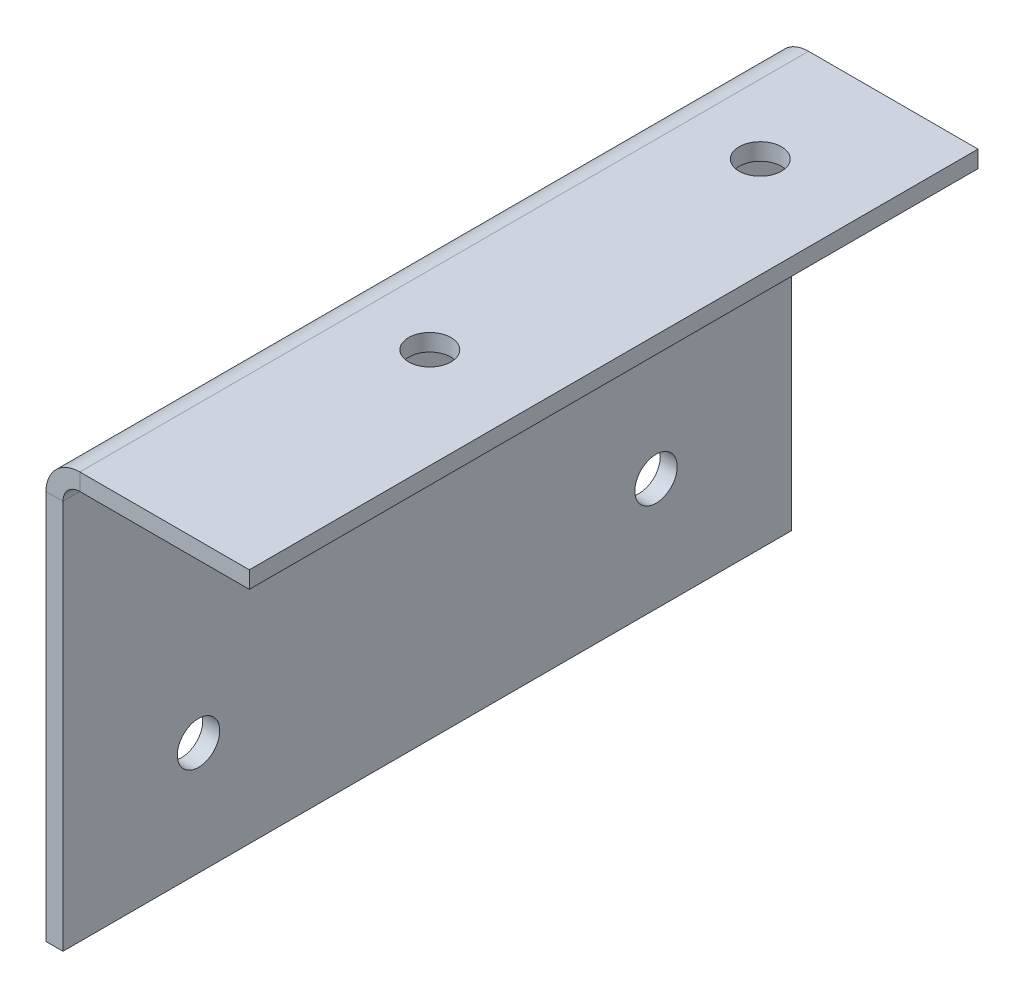
ISO-10303-21;
HEADER;
FILE_DESCRIPTION(('STEP AP214'),'2;1');
FILE_NAME('part.step','',(''),(''),'','','');
FILE_SCHEMA(('AUTOMOTIVE_DESIGN { 1 0 10303 214 1 1 1 1 }'));
ENDSEC;
DATA;
#1=APPLICATION_CONTEXT('core data for automotive mechanical design processes');
#2=APPLICATION_PROTOCOL_DEFINITION('international standard','automotive_design',2000,#1);
#3=PRODUCT_CONTEXT('',#1,'mechanical');
#4=PRODUCT('Part','Part','',(#3));
#5=PRODUCT_RELATED_PRODUCT_CATEGORY('part','',(#4));
#6=PRODUCT_DEFINITION_FORMATION('','',#4);
#7=PRODUCT_DEFINITION_CONTEXT('part definition',#1,'design');
#8=PRODUCT_DEFINITION('design','',#6,#7);
#9=PRODUCT_DEFINITION_SHAPE('','',#8);
#10=(LENGTH_UNIT() NAMED_UNIT(*) SI_UNIT(.MILLI.,.METRE.));
#11=(NAMED_UNIT(*) PLANE_ANGLE_UNIT() SI_UNIT($,.RADIAN.));
#12=(NAMED_UNIT(*) SI_UNIT($,.STERADIAN.) SOLID_ANGLE_UNIT());
#13=UNCERTAINTY_MEASURE_WITH_UNIT(LENGTH_MEASURE(1.E-05),#10,'distance_accuracy_value','');
#14=(GEOMETRIC_REPRESENTATION_CONTEXT(3) GLOBAL_UNCERTAINTY_ASSIGNED_CONTEXT((#13)) GLOBAL_UNIT_ASSIGNED_CONTEXT((#10,
#11,#12)) REPRESENTATION_CONTEXT('',''));
#15=CARTESIAN_POINT('',(0.,0.,0.));
#16=DIRECTION('',(0.,0.,1.));
#17=DIRECTION('',(1.,0.,0.));
#18=AXIS2_PLACEMENT_3D('',#15,#16,#17);
#19=CARTESIAN_POINT('',(-1.,12.5,21.5));
#20=DIRECTION('',(0.,0.,1.));
#21=DIRECTION('',(1.,0.,0.));
#22=AXIS2_PLACEMENT_3D('',#19,#20,#21);
#23=PLANE('',#22);
#24=DIRECTION('',(0.,-1.,0.));
#25=VECTOR('',#24,1.);
#26=CARTESIAN_POINT('',(0.,12.5,21.5));
#27=LINE('',#26,#25);
#28=CARTESIAN_POINT('',(0.,10.5,21.5));
#29=VERTEX_POINT('',#28);
#30=CARTESIAN_POINT('',(0.,-12.5,21.5));
#31=VERTEX_POINT('',#30);
#32=EDGE_CURVE('E103',#29,#31,#27,.T.);
#33=ORIENTED_EDGE('',*,*,#32,.F.);
#34=DIRECTION('',(-1.,0.,0.));
#35=VECTOR('',#34,1.);
#36=CARTESIAN_POINT('',(0.,10.5,21.5));
#37=LINE('',#36,#35);
#38=CARTESIAN_POINT('',(-1.,10.5,21.5));
#39=VERTEX_POINT('',#38);
#40=EDGE_CURVE('E183',#29,#39,#37,.T.);
#41=ORIENTED_EDGE('',*,*,#40,.T.);
#42=DIRECTION('',(0.,-1.,0.));
#43=VECTOR('',#42,1.);
#44=CARTESIAN_POINT('',(-1.,12.5,21.5));
#45=LINE('',#44,#43);
#46=CARTESIAN_POINT('',(-1.,-12.5,21.5));
#47=VERTEX_POINT('',#46);
#48=EDGE_CURVE('E109',#39,#47,#45,.T.);
#49=ORIENTED_EDGE('',*,*,#48,.T.);
#50=DIRECTION('',(1.,0.,0.));
#51=VECTOR('',#50,1.);
#52=CARTESIAN_POINT('',(-1.,-12.5,21.5));
#53=LINE('',#52,#51);
#54=EDGE_CURVE('E65',#47,#31,#53,.T.);
#55=ORIENTED_EDGE('',*,*,#54,.T.);
#56=EDGE_LOOP('',(#33,#41,#49,#55));
#57=FACE_BOUND('',#56,.T.);
#58=ADVANCED_FACE('F56',(#57),#23,.T.);
#59=CARTESIAN_POINT('',(-1.,0.,0.));
#60=DIRECTION('',(1.,0.,0.));
#61=DIRECTION('',(0.,0.,-1.));
#62=AXIS2_PLACEMENT_3D('',#59,#60,#61);
#63=PLANE('',#62);
#64=CARTESIAN_POINT('',(-1.,-5.84801831703269,-13.5));
#65=DIRECTION('',(1.,0.,0.));
#66=DIRECTION('',(0.,0.,-1.));
#67=AXIS2_PLACEMENT_3D('',#64,#65,#66);
#68=CIRCLE('',#67,1.24999999999999);
#69=CARTESIAN_POINT('',(-1.,-5.84801831703269,-14.75));
#70=VERTEX_POINT('',#69);
#71=EDGE_CURVE('E121',#70,#70,#68,.T.);
#72=ORIENTED_EDGE('',*,*,#71,.T.);
#73=EDGE_LOOP('',(#72));
#74=FACE_BOUND('',#73,.T.);
#75=CARTESIAN_POINT('',(-1.,-5.84801831703269,13.5));
#76=DIRECTION('',(1.,0.,0.));
#77=DIRECTION('',(0.,0.,-1.));
#78=AXIS2_PLACEMENT_3D('',#75,#76,#77);
#79=CIRCLE('',#78,1.24999999999999);
#80=CARTESIAN_POINT('',(-1.,-5.84801831703269,12.25));
#81=VERTEX_POINT('',#80);
#82=EDGE_CURVE('E118',#81,#81,#79,.T.);
#83=ORIENTED_EDGE('',*,*,#82,.T.);
#84=EDGE_LOOP('',(#83));
#85=FACE_BOUND('',#84,.T.);
#86=DIRECTION('',(0.,0.,1.));
#87=VECTOR('',#86,1.);
#88=CARTESIAN_POINT('',(-1.,10.5,21.5));
#89=LINE('',#88,#87);
#90=CARTESIAN_POINT('',(-1.,10.5,-21.5));
#91=VERTEX_POINT('',#90);
#92=EDGE_CURVE('E176',#39,#91,#89,.F.);
#93=ORIENTED_EDGE('',*,*,#92,.T.);
#94=DIRECTION('',(0.,1.,0.));
#95=VECTOR('',#94,1.);
#96=CARTESIAN_POINT('',(-1.,12.5,-21.5));
#97=LINE('',#96,#95);
#98=CARTESIAN_POINT('',(-1.,-12.5,-21.5));
#99=VERTEX_POINT('',#98);
#100=EDGE_CURVE('E107',#99,#91,#97,.T.);
#101=ORIENTED_EDGE('',*,*,#100,.F.);
#102=DIRECTION('',(0.,0.,-1.));
#103=VECTOR('',#102,1.);
#104=CARTESIAN_POINT('',(-1.,-12.5,21.5));
#105=LINE('',#104,#103);
#106=EDGE_CURVE('E97',#47,#99,#105,.T.);
#107=ORIENTED_EDGE('',*,*,#106,.F.);
#108=ORIENTED_EDGE('',*,*,#48,.F.);
#109=EDGE_LOOP('',(#93,#101,#107,#108));
#110=FACE_BOUND('',#109,.T.);
#111=ADVANCED_FACE('F202',(#74,#85,#110),#63,.F.);
#112=CARTESIAN_POINT('',(0.,0.,0.));
#113=DIRECTION('',(1.,0.,0.));
#114=DIRECTION('',(0.,0.,-1.));
#115=AXIS2_PLACEMENT_3D('',#112,#113,#114);
#116=PLANE('',#115);
#117=CARTESIAN_POINT('',(0.,-5.84801831703269,-13.5));
#118=DIRECTION('',(1.,0.,0.));
#119=DIRECTION('',(0.,0.,-1.));
#120=AXIS2_PLACEMENT_3D('',#117,#118,#119);
#121=CIRCLE('',#120,1.24999999999999);
#122=CARTESIAN_POINT('',(0.,-5.84801831703269,-14.75));
#123=VERTEX_POINT('',#122);
#124=EDGE_CURVE('E60',#123,#123,#121,.T.);
#125=ORIENTED_EDGE('',*,*,#124,.F.);
#126=EDGE_LOOP('',(#125));
#127=FACE_BOUND('',#126,.T.);
#128=CARTESIAN_POINT('',(0.,-5.84801831703269,13.5));
#129=DIRECTION('',(1.,0.,0.));
#130=DIRECTION('',(0.,0.,-1.));
#131=AXIS2_PLACEMENT_3D('',#128,#129,#130);
#132=CIRCLE('',#131,1.24999999999999);
#133=CARTESIAN_POINT('',(0.,-5.84801831703269,12.25));
#134=VERTEX_POINT('',#133);
#135=EDGE_CURVE('E120',#134,#134,#132,.T.);
#136=ORIENTED_EDGE('',*,*,#135,.F.);
#137=EDGE_LOOP('',(#136));
#138=FACE_BOUND('',#137,.T.);
#139=DIRECTION('',(0.,1.,0.));
#140=VECTOR('',#139,1.);
#141=CARTESIAN_POINT('',(0.,12.5,-21.5));
#142=LINE('',#141,#140);
#143=CARTESIAN_POINT('',(0.,-12.5,-21.5));
#144=VERTEX_POINT('',#143);
#145=CARTESIAN_POINT('',(0.,10.5,-21.5));
#146=VERTEX_POINT('',#145);
#147=EDGE_CURVE('E99',#144,#146,#142,.T.);
#148=ORIENTED_EDGE('',*,*,#147,.T.);
#149=DIRECTION('',(0.,0.,1.));
#150=VECTOR('',#149,1.);
#151=CARTESIAN_POINT('',(0.,10.5,21.5));
#152=LINE('',#151,#150);
#153=EDGE_CURVE('E73',#29,#146,#152,.F.);
#154=ORIENTED_EDGE('',*,*,#153,.F.);
#155=ORIENTED_EDGE('',*,*,#32,.T.);
#156=DIRECTION('',(0.,0.,-1.));
#157=VECTOR('',#156,1.);
#158=CARTESIAN_POINT('',(0.,-12.5,21.5));
#159=LINE('',#158,#157);
#160=EDGE_CURVE('E95',#31,#144,#159,.T.);
#161=ORIENTED_EDGE('',*,*,#160,.T.);
#162=EDGE_LOOP('',(#148,#154,#155,#161));
#163=FACE_BOUND('',#162,.T.);
#164=ADVANCED_FACE('F105',(#127,#138,#163),#116,.T.);
#165=CARTESIAN_POINT('',(-1.,12.5,-21.5));
#166=DIRECTION('',(0.,0.,-1.));
#167=DIRECTION('',(-1.,0.,0.));
#168=AXIS2_PLACEMENT_3D('',#165,#166,#167);
#169=PLANE('',#168);
#170=DIRECTION('',(-1.,0.,0.));
#171=VECTOR('',#170,1.);
#172=CARTESIAN_POINT('',(0.,10.5,-21.5));
#173=LINE('',#172,#171);
#174=EDGE_CURVE('E102',#146,#91,#173,.T.);
#175=ORIENTED_EDGE('',*,*,#174,.F.);
#176=ORIENTED_EDGE('',*,*,#147,.F.);
#177=DIRECTION('',(1.,0.,0.));
#178=VECTOR('',#177,1.);
#179=CARTESIAN_POINT('',(-1.,-12.5,-21.5));
#180=LINE('',#179,#178);
#181=EDGE_CURVE('E13',#99,#144,#180,.T.);
#182=ORIENTED_EDGE('',*,*,#181,.F.);
#183=ORIENTED_EDGE('',*,*,#100,.T.);
#184=EDGE_LOOP('',(#175,#176,#182,#183));
#185=FACE_BOUND('',#184,.T.);
#186=ADVANCED_FACE('F58',(#185),#169,.T.);
#187=CARTESIAN_POINT('',(-1.,-12.5,21.5));
#188=DIRECTION('',(0.,-1.,0.));
#189=DIRECTION('',(0.,0.,-1.));
#190=AXIS2_PLACEMENT_3D('',#187,#188,#189);
#191=PLANE('',#190);
#192=ORIENTED_EDGE('',*,*,#160,.F.);
#193=ORIENTED_EDGE('',*,*,#54,.F.);
#194=ORIENTED_EDGE('',*,*,#106,.T.);
#195=ORIENTED_EDGE('',*,*,#181,.T.);
#196=EDGE_LOOP('',(#192,#193,#194,#195));
#197=FACE_BOUND('',#196,.T.);
#198=ADVANCED_FACE('F92',(#197),#191,.T.);
#199=CARTESIAN_POINT('',(0.999999999999999,10.5,-21.5));
#200=DIRECTION('',(0.,0.,-1.));
#201=DIRECTION('',(-1.,0.,0.));
#202=AXIS2_PLACEMENT_3D('',#199,#200,#201);
#203=PLANE('',#202);
#204=DIRECTION('',(0.,-1.,0.));
#205=VECTOR('',#204,1.);
#206=CARTESIAN_POINT('',(0.999999999999994,12.5,-21.5));
#207=LINE('',#206,#205);
#208=CARTESIAN_POINT('',(0.999999999999996,11.5,-21.5));
#209=VERTEX_POINT('',#208);
#210=CARTESIAN_POINT('',(0.999999999999992,12.5,-21.5));
#211=VERTEX_POINT('',#210);
#212=EDGE_CURVE('E139',#209,#211,#207,.F.);
#213=ORIENTED_EDGE('',*,*,#212,.F.);
#214=CARTESIAN_POINT('',(0.999999999999999,10.5,-21.5));
#215=DIRECTION('',(0.,0.,1.));
#216=DIRECTION('',(1.,0.,0.));
#217=AXIS2_PLACEMENT_3D('',#214,#215,#216);
#218=CIRCLE('',#217,1.);
#219=EDGE_CURVE('E186',#146,#209,#218,.F.);
#220=ORIENTED_EDGE('',*,*,#219,.F.);
#221=ORIENTED_EDGE('',*,*,#174,.T.);
#222=CARTESIAN_POINT('',(0.999999999999999,10.5,-21.5));
#223=DIRECTION('',(0.,0.,1.));
#224=DIRECTION('',(1.,0.,0.));
#225=AXIS2_PLACEMENT_3D('',#222,#223,#224);
#226=CIRCLE('',#225,2.);
#227=EDGE_CURVE('E179',#91,#211,#226,.F.);
#228=ORIENTED_EDGE('',*,*,#227,.T.);
#229=EDGE_LOOP('',(#213,#220,#221,#228));
#230=FACE_BOUND('',#229,.T.);
#231=ADVANCED_FACE('F207',(#230),#203,.T.);
#232=CARTESIAN_POINT('',(0.999999999999999,10.5,21.5));
#233=DIRECTION('',(0.,0.,-1.));
#234=DIRECTION('',(-1.,0.,0.));
#235=AXIS2_PLACEMENT_3D('',#232,#233,#234);
#236=PLANE('',#235);
#237=CARTESIAN_POINT('',(0.999999999999999,10.5,21.5));
#238=DIRECTION('',(0.,0.,1.));
#239=DIRECTION('',(1.,0.,0.));
#240=AXIS2_PLACEMENT_3D('',#237,#238,#239);
#241=CIRCLE('',#240,1.);
#242=CARTESIAN_POINT('',(0.999999999999996,11.5,21.5));
#243=VERTEX_POINT('',#242);
#244=EDGE_CURVE('E143',#243,#29,#241,.T.);
#245=ORIENTED_EDGE('',*,*,#244,.F.);
#246=DIRECTION('',(0.,-1.,0.));
#247=VECTOR('',#246,1.);
#248=CARTESIAN_POINT('',(0.999999999999994,11.5,21.5));
#249=LINE('',#248,#247);
#250=CARTESIAN_POINT('',(0.99999999999999,12.5,21.5));
#251=VERTEX_POINT('',#250);
#252=EDGE_CURVE('E168',#243,#251,#249,.F.);
#253=ORIENTED_EDGE('',*,*,#252,.T.);
#254=CARTESIAN_POINT('',(0.999999999999999,10.5,21.5));
#255=DIRECTION('',(0.,0.,1.));
#256=DIRECTION('',(1.,0.,0.));
#257=AXIS2_PLACEMENT_3D('',#254,#255,#256);
#258=CIRCLE('',#257,2.);
#259=EDGE_CURVE('E180',#251,#39,#258,.T.);
#260=ORIENTED_EDGE('',*,*,#259,.T.);
#261=ORIENTED_EDGE('',*,*,#40,.F.);
#262=EDGE_LOOP('',(#245,#253,#260,#261));
#263=FACE_BOUND('',#262,.T.);
#264=ADVANCED_FACE('F251',(#263),#236,.F.);
#265=CARTESIAN_POINT('',(0.999999999999999,10.5,21.5));
#266=DIRECTION('',(0.,0.,1.));
#267=DIRECTION('',(0.,1.,0.));
#268=AXIS2_PLACEMENT_3D('',#265,#266,#267);
#269=CYLINDRICAL_SURFACE('',#268,2.);
#270=ORIENTED_EDGE('',*,*,#92,.F.);
#271=ORIENTED_EDGE('',*,*,#259,.F.);
#272=DIRECTION('',(0.,0.,1.));
#273=VECTOR('',#272,1.);
#274=CARTESIAN_POINT('',(0.999999999999994,12.5,-21.5));
#275=LINE('',#274,#273);
#276=EDGE_CURVE('E165',#251,#211,#275,.F.);
#277=ORIENTED_EDGE('',*,*,#276,.T.);
#278=ORIENTED_EDGE('',*,*,#227,.F.);
#279=EDGE_LOOP('',(#270,#271,#277,#278));
#280=FACE_BOUND('',#279,.T.);
#281=ADVANCED_FACE('F210',(#280),#269,.T.);
#282=CARTESIAN_POINT('',(0.999999999999999,10.5,21.5));
#283=DIRECTION('',(0.,0.,1.));
#284=DIRECTION('',(0.,1.,0.));
#285=AXIS2_PLACEMENT_3D('',#282,#283,#284);
#286=CYLINDRICAL_SURFACE('',#285,1.);
#287=ORIENTED_EDGE('',*,*,#153,.T.);
#288=ORIENTED_EDGE('',*,*,#219,.T.);
#289=DIRECTION('',(0.,0.,1.));
#290=VECTOR('',#289,1.);
#291=CARTESIAN_POINT('',(0.999999999999997,11.5,-21.5));
#292=LINE('',#291,#290);
#293=EDGE_CURVE('E171',#209,#243,#292,.T.);
#294=ORIENTED_EDGE('',*,*,#293,.T.);
#295=ORIENTED_EDGE('',*,*,#244,.T.);
#296=EDGE_LOOP('',(#287,#288,#294,#295));
#297=FACE_BOUND('',#296,.T.);
#298=ADVANCED_FACE('F247',(#297),#286,.F.);
#299=CARTESIAN_POINT('',(0.,12.5,-21.5));
#300=DIRECTION('',(0.,0.,1.));
#301=DIRECTION('',(1.,0.,0.));
#302=AXIS2_PLACEMENT_3D('',#299,#300,#301);
#303=PLANE('',#302);
#304=ORIENTED_EDGE('',*,*,#212,.T.);
#305=DIRECTION('',(-1.,0.,0.));
#306=VECTOR('',#305,1.);
#307=CARTESIAN_POINT('',(0.,12.5,-21.5));
#308=LINE('',#307,#306);
#309=CARTESIAN_POINT('',(11.,12.5,-21.5));
#310=VERTEX_POINT('',#309);
#311=EDGE_CURVE('E153',#310,#211,#308,.T.);
#312=ORIENTED_EDGE('',*,*,#311,.F.);
#313=DIRECTION('',(0.,-1.,0.));
#314=VECTOR('',#313,1.);
#315=CARTESIAN_POINT('',(11.,12.5,-21.5));
#316=LINE('',#315,#314);
#317=CARTESIAN_POINT('',(11.,11.5,-21.5));
#318=VERTEX_POINT('',#317);
#319=EDGE_CURVE('E144',#310,#318,#316,.T.);
#320=ORIENTED_EDGE('',*,*,#319,.T.);
#321=DIRECTION('',(1.,0.,0.));
#322=VECTOR('',#321,1.);
#323=CARTESIAN_POINT('',(0.,11.5,-21.5));
#324=LINE('',#323,#322);
#325=EDGE_CURVE('E162',#318,#209,#324,.F.);
#326=ORIENTED_EDGE('',*,*,#325,.T.);
#327=EDGE_LOOP('',(#304,#312,#320,#326));
#328=FACE_BOUND('',#327,.T.);
#329=ADVANCED_FACE('F308',(#328),#303,.F.);
#330=CARTESIAN_POINT('',(11.,12.5,21.5));
#331=DIRECTION('',(0.,0.,-1.));
#332=DIRECTION('',(-1.,0.,0.));
#333=AXIS2_PLACEMENT_3D('',#330,#331,#332);
#334=PLANE('',#333);
#335=ORIENTED_EDGE('',*,*,#252,.F.);
#336=DIRECTION('',(-1.,0.,0.));
#337=VECTOR('',#336,1.);
#338=CARTESIAN_POINT('',(11.,11.5,21.5));
#339=LINE('',#338,#337);
#340=CARTESIAN_POINT('',(11.,11.5,21.5));
#341=VERTEX_POINT('',#340);
#342=EDGE_CURVE('E159',#243,#341,#339,.F.);
#343=ORIENTED_EDGE('',*,*,#342,.T.);
#344=DIRECTION('',(0.,-1.,0.));
#345=VECTOR('',#344,1.);
#346=CARTESIAN_POINT('',(11.,12.5,21.5));
#347=LINE('',#346,#345);
#348=CARTESIAN_POINT('',(11.,12.5,21.5));
#349=VERTEX_POINT('',#348);
#350=EDGE_CURVE('E140',#349,#341,#347,.T.);
#351=ORIENTED_EDGE('',*,*,#350,.F.);
#352=DIRECTION('',(1.,0.,0.));
#353=VECTOR('',#352,1.);
#354=CARTESIAN_POINT('',(0.,12.5,21.5));
#355=LINE('',#354,#353);
#356=EDGE_CURVE('E150',#251,#349,#355,.T.);
#357=ORIENTED_EDGE('',*,*,#356,.F.);
#358=EDGE_LOOP('',(#335,#343,#351,#357));
#359=FACE_BOUND('',#358,.T.);
#360=ADVANCED_FACE('F226',(#359),#334,.F.);
#361=CARTESIAN_POINT('',(0.,12.5,0.));
#362=DIRECTION('',(0.,-1.,0.));
#363=DIRECTION('',(1.,0.,0.));
#364=AXIS2_PLACEMENT_3D('',#361,#362,#363);
#365=PLANE('',#364);
#366=CARTESIAN_POINT('',(5.08000000020808,12.5,4.92923767251513));
#367=DIRECTION('',(0.,1.,0.));
#368=DIRECTION('',(0.,0.,1.));
#369=AXIS2_PLACEMENT_3D('',#366,#367,#368);
#370=CIRCLE('',#369,1.24999999999999);
#371=CARTESIAN_POINT('',(5.08000000020808,12.5,6.17923767251512));
#372=VERTEX_POINT('',#371);
#373=EDGE_CURVE('E117',#372,#372,#370,.T.);
#374=ORIENTED_EDGE('',*,*,#373,.F.);
#375=EDGE_LOOP('',(#374));
#376=FACE_BOUND('',#375,.T.);
#377=CARTESIAN_POINT('',(5.08000000020808,12.5,-14.5707623274849));
#378=DIRECTION('',(0.,1.,0.));
#379=DIRECTION('',(0.,0.,1.));
#380=AXIS2_PLACEMENT_3D('',#377,#378,#379);
#381=CIRCLE('',#380,1.24999999999999);
#382=CARTESIAN_POINT('',(5.08000000020808,12.5,-13.3207623274849));
#383=VERTEX_POINT('',#382);
#384=EDGE_CURVE('E116',#383,#383,#381,.T.);
#385=ORIENTED_EDGE('',*,*,#384,.F.);
#386=EDGE_LOOP('',(#385));
#387=FACE_BOUND('',#386,.T.);
#388=ORIENTED_EDGE('',*,*,#276,.F.);
#389=ORIENTED_EDGE('',*,*,#356,.T.);
#390=DIRECTION('',(0.,0.,-1.));
#391=VECTOR('',#390,1.);
#392=CARTESIAN_POINT('',(11.,12.5,0.));
#393=LINE('',#392,#391);
#394=EDGE_CURVE('E147',#349,#310,#393,.T.);
#395=ORIENTED_EDGE('',*,*,#394,.T.);
#396=ORIENTED_EDGE('',*,*,#311,.T.);
#397=EDGE_LOOP('',(#388,#389,#395,#396));
#398=FACE_BOUND('',#397,.T.);
#399=ADVANCED_FACE('F218',(#376,#387,#398),#365,.F.);
#400=CARTESIAN_POINT('',(0.,11.5,0.));
#401=DIRECTION('',(0.,-1.,0.));
#402=DIRECTION('',(1.,0.,0.));
#403=AXIS2_PLACEMENT_3D('',#400,#401,#402);
#404=PLANE('',#403);
#405=CARTESIAN_POINT('',(5.08000000020808,11.5,4.92923767251513));
#406=DIRECTION('',(0.,-1.,0.));
#407=DIRECTION('',(1.,0.,0.));
#408=AXIS2_PLACEMENT_3D('',#405,#406,#407);
#409=CIRCLE('',#408,1.24999999999998);
#410=CARTESIAN_POINT('',(6.33000000020807,11.5,4.92923767251513));
#411=VERTEX_POINT('',#410);
#412=EDGE_CURVE('E114',#411,#411,#409,.T.);
#413=ORIENTED_EDGE('',*,*,#412,.F.);
#414=EDGE_LOOP('',(#413));
#415=FACE_BOUND('',#414,.T.);
#416=CARTESIAN_POINT('',(5.08000000020808,11.5,-14.5707623274849));
#417=DIRECTION('',(0.,-1.,0.));
#418=DIRECTION('',(1.,0.,0.));
#419=AXIS2_PLACEMENT_3D('',#416,#417,#418);
#420=CIRCLE('',#419,1.24999999999998);
#421=CARTESIAN_POINT('',(6.33000000020807,11.5,-14.5707623274849));
#422=VERTEX_POINT('',#421);
#423=EDGE_CURVE('E136',#422,#422,#420,.T.);
#424=ORIENTED_EDGE('',*,*,#423,.F.);
#425=EDGE_LOOP('',(#424));
#426=FACE_BOUND('',#425,.T.);
#427=ORIENTED_EDGE('',*,*,#342,.F.);
#428=ORIENTED_EDGE('',*,*,#293,.F.);
#429=ORIENTED_EDGE('',*,*,#325,.F.);
#430=DIRECTION('',(0.,0.,1.));
#431=VECTOR('',#430,1.);
#432=CARTESIAN_POINT('',(11.,11.5,-21.5));
#433=LINE('',#432,#431);
#434=EDGE_CURVE('E156',#341,#318,#433,.F.);
#435=ORIENTED_EDGE('',*,*,#434,.F.);
#436=EDGE_LOOP('',(#427,#428,#429,#435));
#437=FACE_BOUND('',#436,.T.);
#438=ADVANCED_FACE('F299',(#415,#426,#437),#404,.T.);
#439=CARTESIAN_POINT('',(11.,12.5,-21.5));
#440=DIRECTION('',(-1.,0.,0.));
#441=DIRECTION('',(0.,-1.,0.));
#442=AXIS2_PLACEMENT_3D('',#439,#440,#441);
#443=PLANE('',#442);
#444=ORIENTED_EDGE('',*,*,#434,.T.);
#445=ORIENTED_EDGE('',*,*,#319,.F.);
#446=ORIENTED_EDGE('',*,*,#394,.F.);
#447=ORIENTED_EDGE('',*,*,#350,.T.);
#448=EDGE_LOOP('',(#444,#445,#446,#447));
#449=FACE_BOUND('',#448,.T.);
#450=ADVANCED_FACE('F235',(#449),#443,.F.);
#451=CARTESIAN_POINT('',(5.08000000020808,12.5,-14.5707623274849));
#452=DIRECTION('',(0.,1.,0.));
#453=DIRECTION('',(0.,0.,1.));
#454=AXIS2_PLACEMENT_3D('',#451,#452,#453);
#455=CYLINDRICAL_SURFACE('',#454,1.24999999999998);
#456=ORIENTED_EDGE('',*,*,#423,.T.);
#457=EDGE_LOOP('',(#456));
#458=FACE_BOUND('',#457,.T.);
#459=ORIENTED_EDGE('',*,*,#384,.T.);
#460=EDGE_LOOP('',(#459));
#461=FACE_BOUND('',#460,.T.);
#462=ADVANCED_FACE('F290',(#458,#461),#455,.F.);
#463=CARTESIAN_POINT('',(5.08000000020808,12.5,4.92923767251513));
#464=DIRECTION('',(0.,1.,0.));
#465=DIRECTION('',(0.,0.,1.));
#466=AXIS2_PLACEMENT_3D('',#463,#464,#465);
#467=CYLINDRICAL_SURFACE('',#466,1.24999999999998);
#468=ORIENTED_EDGE('',*,*,#412,.T.);
#469=EDGE_LOOP('',(#468));
#470=FACE_BOUND('',#469,.T.);
#471=ORIENTED_EDGE('',*,*,#373,.T.);
#472=EDGE_LOOP('',(#471));
#473=FACE_BOUND('',#472,.T.);
#474=ADVANCED_FACE('F283',(#470,#473),#467,.F.);
#475=CARTESIAN_POINT('',(1.99999999999995,-5.84801831703269,13.5));
#476=DIRECTION('',(1.,0.,0.));
#477=DIRECTION('',(0.,0.,-1.));
#478=AXIS2_PLACEMENT_3D('',#475,#476,#477);
#479=CYLINDRICAL_SURFACE('',#478,1.24999999999999);
#480=ORIENTED_EDGE('',*,*,#135,.T.);
#481=EDGE_LOOP('',(#480));
#482=FACE_BOUND('',#481,.T.);
#483=ORIENTED_EDGE('',*,*,#82,.F.);
#484=EDGE_LOOP('',(#483));
#485=FACE_BOUND('',#484,.T.);
#486=ADVANCED_FACE('F279',(#482,#485),#479,.F.);
#487=CARTESIAN_POINT('',(1.99999999999994,-5.84801831703269,-13.5));
#488=DIRECTION('',(1.,0.,0.));
#489=DIRECTION('',(0.,0.,-1.));
#490=AXIS2_PLACEMENT_3D('',#487,#488,#489);
#491=CYLINDRICAL_SURFACE('',#490,1.24999999999999);
#492=ORIENTED_EDGE('',*,*,#124,.T.);
#493=EDGE_LOOP('',(#492));
#494=FACE_BOUND('',#493,.T.);
#495=ORIENTED_EDGE('',*,*,#71,.F.);
#496=EDGE_LOOP('',(#495));
#497=FACE_BOUND('',#496,.T.);
#498=ADVANCED_FACE('F282',(#494,#497),#491,.F.);
#499=CLOSED_SHELL('',(#58,#111,#164,#186,#198,#231,#264,#281,#298,#329,#360,#399,#438,#450,#462,
#474,#486,#498));
#500=MANIFOLD_SOLID_BREP('B2',#499);
#501=ADVANCED_BREP_SHAPE_REPRESENTATION('',(#18,#500),#14);
#502=SHAPE_DEFINITION_REPRESENTATION(#9,#501);
ENDSEC;
END-ISO-10303-21;
